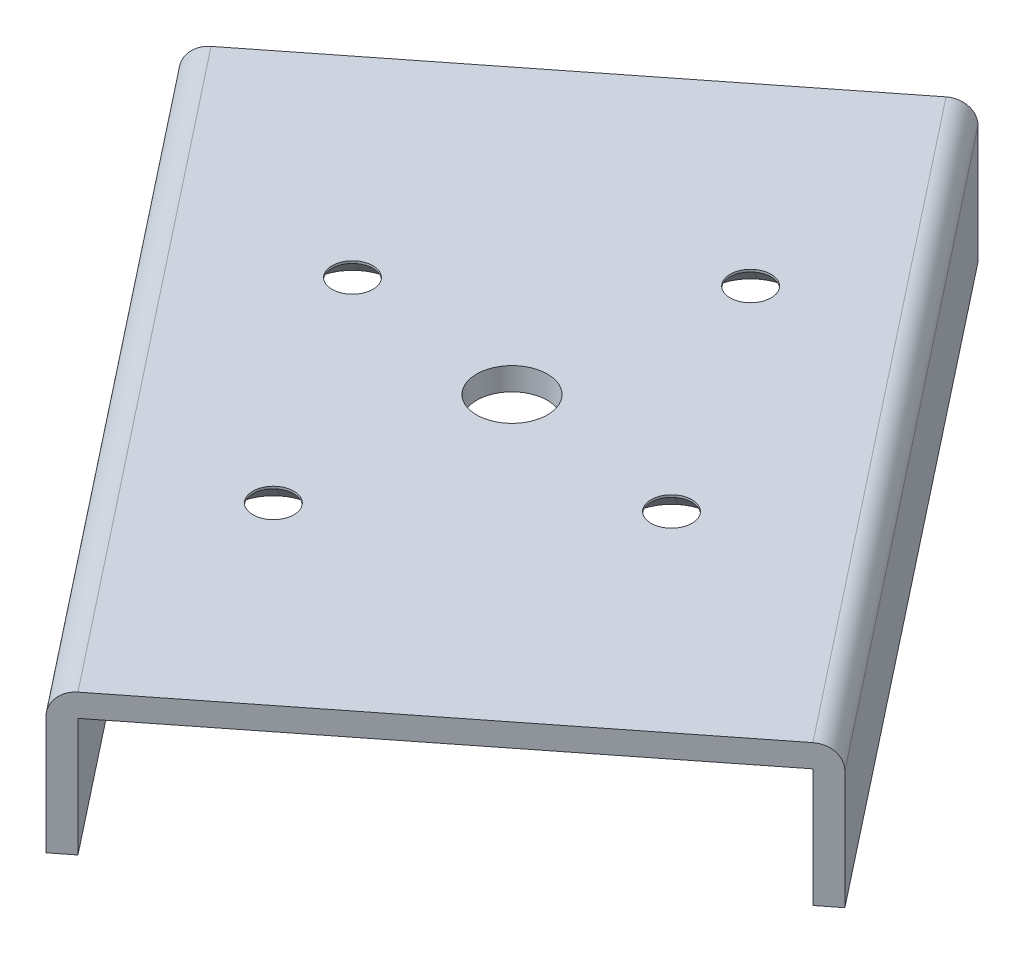
ISO-10303-21;
HEADER;
FILE_DESCRIPTION(('STEP AP214'),'2;1');
FILE_NAME('part.step','',(''),(''),'','','');
FILE_SCHEMA(('AUTOMOTIVE_DESIGN { 1 0 10303 214 1 1 1 1 }'));
ENDSEC;
DATA;
#1=APPLICATION_CONTEXT('core data for automotive mechanical design processes');
#2=APPLICATION_PROTOCOL_DEFINITION('international standard','automotive_design',2000,#1);
#3=PRODUCT_CONTEXT('',#1,'mechanical');
#4=PRODUCT('Part','Part','',(#3));
#5=PRODUCT_RELATED_PRODUCT_CATEGORY('part','',(#4));
#6=PRODUCT_DEFINITION_FORMATION('','',#4);
#7=PRODUCT_DEFINITION_CONTEXT('part definition',#1,'design');
#8=PRODUCT_DEFINITION('design','',#6,#7);
#9=PRODUCT_DEFINITION_SHAPE('','',#8);
#10=(LENGTH_UNIT() NAMED_UNIT(*) SI_UNIT(.MILLI.,.METRE.));
#11=(NAMED_UNIT(*) PLANE_ANGLE_UNIT() SI_UNIT($,.RADIAN.));
#12=(NAMED_UNIT(*) SI_UNIT($,.STERADIAN.) SOLID_ANGLE_UNIT());
#13=UNCERTAINTY_MEASURE_WITH_UNIT(LENGTH_MEASURE(1.E-05),#10,'distance_accuracy_value','');
#14=(GEOMETRIC_REPRESENTATION_CONTEXT(3) GLOBAL_UNCERTAINTY_ASSIGNED_CONTEXT((#13)) GLOBAL_UNIT_ASSIGNED_CONTEXT((#10,
#11,#12)) REPRESENTATION_CONTEXT('',''));
#15=CARTESIAN_POINT('',(0.,0.,0.));
#16=DIRECTION('',(0.,0.,1.));
#17=DIRECTION('',(1.,0.,0.));
#18=AXIS2_PLACEMENT_3D('',#15,#16,#17);
#19=CARTESIAN_POINT('',(156.638062088409,19.0000000000001,265.59404758917));
#20=DIRECTION('',(0.,-1.,0.));
#21=DIRECTION('',(0.618589574131745,0.,0.785714285714283));
#22=AXIS2_PLACEMENT_3D('',#19,#20,#21);
#23=CONICAL_SURFACE('',#22,1.8,0.785398163397449);
#24=DIRECTION('',(-0.437408882639855,-0.707106781186549,-0.555583899503713));
#25=VECTOR('',#24,1.);
#26=CARTESIAN_POINT('',(155.524600854972,19.,264.179761874884));
#27=LINE('',#26,#25);
#28=CARTESIAN_POINT('',(156.081331471691,19.9000000000001,264.886904732027));
#29=VERTEX_POINT('',#28);
#30=CARTESIAN_POINT('',(155.524600854972,19.,264.179761874884));
#31=VERTEX_POINT('',#30);
#32=EDGE_CURVE('E342',#29,#31,#27,.T.);
#33=ORIENTED_EDGE('',*,*,#32,.F.);
#34=CARTESIAN_POINT('',(156.638062088409,19.9000000000001,265.59404758917));
#35=DIRECTION('',(0.,-1.,0.));
#36=DIRECTION('',(0.618589574131745,0.,0.785714285714283));
#37=AXIS2_PLACEMENT_3D('',#34,#35,#36);
#38=CIRCLE('',#37,0.899999999999984);
#39=CARTESIAN_POINT('',(157.194792705128,19.9000000000001,266.301190446313));
#40=VERTEX_POINT('',#39);
#41=EDGE_CURVE('E11',#40,#29,#38,.T.);
#42=ORIENTED_EDGE('',*,*,#41,.F.);
#43=DIRECTION('',(0.437408882639856,-0.707106781186545,0.555583899503716));
#44=VECTOR('',#43,1.);
#45=CARTESIAN_POINT('',(157.751523321847,19.0000000000001,267.008333303456));
#46=LINE('',#45,#44);
#47=CARTESIAN_POINT('',(157.751523321847,19.0000000000001,267.008333303456));
#48=VERTEX_POINT('',#47);
#49=EDGE_CURVE('E341',#40,#48,#46,.T.);
#50=ORIENTED_EDGE('',*,*,#49,.T.);
#51=CARTESIAN_POINT('',(156.638062088409,19.0000000000001,265.59404758917));
#52=DIRECTION('',(0.,-1.,0.));
#53=DIRECTION('',(0.618589574131745,0.,0.785714285714283));
#54=AXIS2_PLACEMENT_3D('',#51,#52,#53);
#55=CIRCLE('',#54,1.8);
#56=EDGE_CURVE('E400',#48,#31,#55,.T.);
#57=ORIENTED_EDGE('',*,*,#56,.T.);
#58=EDGE_LOOP('',(#33,#42,#50,#57));
#59=FACE_BOUND('',#58,.T.);
#60=ADVANCED_FACE('F42',(#59),#23,.F.);
#61=CARTESIAN_POINT('',(156.638062088409,19.0000000000001,265.59404758917));
#62=DIRECTION('',(0.,-1.,0.));
#63=DIRECTION('',(0.618589574131745,0.,0.785714285714283));
#64=AXIS2_PLACEMENT_3D('',#61,#62,#63);
#65=CYLINDRICAL_SURFACE('',#64,0.899999999999981);
#66=DIRECTION('',(0.,-1.,0.));
#67=VECTOR('',#66,1.);
#68=CARTESIAN_POINT('',(156.081331471691,19.,264.886904732027));
#69=LINE('',#68,#67);
#70=CARTESIAN_POINT('',(156.081331471691,20.,264.886904732027));
#71=VERTEX_POINT('',#70);
#72=EDGE_CURVE('E380',#71,#29,#69,.T.);
#73=ORIENTED_EDGE('',*,*,#72,.F.);
#74=CARTESIAN_POINT('',(156.638062088409,20.,265.59404758917));
#75=DIRECTION('',(0.,-1.,0.));
#76=DIRECTION('',(0.785714285714283,0.,-0.618589574131745));
#77=AXIS2_PLACEMENT_3D('',#74,#75,#76);
#78=CIRCLE('',#77,0.89999999999998);
#79=CARTESIAN_POINT('',(157.194792705128,20.0000000000001,266.301190446313));
#80=VERTEX_POINT('',#79);
#81=EDGE_CURVE('E328',#80,#71,#78,.T.);
#82=ORIENTED_EDGE('',*,*,#81,.F.);
#83=DIRECTION('',(0.,-1.,0.));
#84=VECTOR('',#83,1.);
#85=CARTESIAN_POINT('',(157.194792705128,19.0000000000001,266.301190446313));
#86=LINE('',#85,#84);
#87=EDGE_CURVE('E389',#80,#40,#86,.T.);
#88=ORIENTED_EDGE('',*,*,#87,.T.);
#89=ORIENTED_EDGE('',*,*,#41,.T.);
#90=EDGE_LOOP('',(#73,#82,#88,#89));
#91=FACE_BOUND('',#90,.T.);
#92=ADVANCED_FACE('F615',(#91),#65,.F.);
#93=CARTESIAN_POINT('',(149.795627106775,19.,255.277049264943));
#94=DIRECTION('',(0.,-1.,0.));
#95=DIRECTION('',(0.618589574131745,0.,0.785714285714283));
#96=AXIS2_PLACEMENT_3D('',#93,#94,#95);
#97=CONICAL_SURFACE('',#96,1.8,0.785398163397449);
#98=DIRECTION('',(-0.437408882639855,-0.707106781186549,-0.555583899503713));
#99=VECTOR('',#98,1.);
#100=CARTESIAN_POINT('',(148.682165873337,19.,253.862763550657));
#101=LINE('',#100,#99);
#102=CARTESIAN_POINT('',(149.238896490056,19.9,254.5699064078));
#103=VERTEX_POINT('',#102);
#104=CARTESIAN_POINT('',(148.682165873337,19.,253.862763550657));
#105=VERTEX_POINT('',#104);
#106=EDGE_CURVE('E336',#103,#105,#101,.T.);
#107=ORIENTED_EDGE('',*,*,#106,.F.);
#108=CARTESIAN_POINT('',(149.795627106775,19.9,255.277049264943));
#109=DIRECTION('',(0.,-1.,0.));
#110=DIRECTION('',(0.618589574131745,0.,0.785714285714283));
#111=AXIS2_PLACEMENT_3D('',#108,#109,#110);
#112=CIRCLE('',#111,0.899999999999984);
#113=CARTESIAN_POINT('',(150.352357723493,19.9,255.984192122086));
#114=VERTEX_POINT('',#113);
#115=EDGE_CURVE('E53',#114,#103,#112,.T.);
#116=ORIENTED_EDGE('',*,*,#115,.F.);
#117=DIRECTION('',(0.437408882639856,-0.707106781186545,0.555583899503716));
#118=VECTOR('',#117,1.);
#119=CARTESIAN_POINT('',(150.909088340212,19.,256.691334979229));
#120=LINE('',#119,#118);
#121=CARTESIAN_POINT('',(150.909088340212,19.,256.691334979229));
#122=VERTEX_POINT('',#121);
#123=EDGE_CURVE('E335',#114,#122,#120,.T.);
#124=ORIENTED_EDGE('',*,*,#123,.T.);
#125=CARTESIAN_POINT('',(149.795627106775,19.,255.277049264943));
#126=DIRECTION('',(0.,-1.,0.));
#127=DIRECTION('',(0.618589574131745,0.,0.785714285714283));
#128=AXIS2_PLACEMENT_3D('',#125,#126,#127);
#129=CIRCLE('',#128,1.8);
#130=EDGE_CURVE('E346',#122,#105,#129,.T.);
#131=ORIENTED_EDGE('',*,*,#130,.T.);
#132=EDGE_LOOP('',(#107,#116,#124,#131));
#133=FACE_BOUND('',#132,.T.);
#134=ADVANCED_FACE('F620',(#133),#97,.F.);
#135=CARTESIAN_POINT('',(149.795627106775,19.,255.277049264943));
#136=DIRECTION('',(0.,-1.,0.));
#137=DIRECTION('',(0.618589574131745,0.,0.785714285714283));
#138=AXIS2_PLACEMENT_3D('',#135,#136,#137);
#139=CYLINDRICAL_SURFACE('',#138,0.899999999999979);
#140=DIRECTION('',(0.,-1.,0.));
#141=VECTOR('',#140,1.);
#142=CARTESIAN_POINT('',(149.238896490056,19.,254.5699064078));
#143=LINE('',#142,#141);
#144=CARTESIAN_POINT('',(149.238896490056,20.,254.5699064078));
#145=VERTEX_POINT('',#144);
#146=EDGE_CURVE('E465',#145,#103,#143,.T.);
#147=ORIENTED_EDGE('',*,*,#146,.F.);
#148=CARTESIAN_POINT('',(149.795627106775,20.,255.277049264943));
#149=DIRECTION('',(0.,-1.,0.));
#150=DIRECTION('',(0.785714285714283,0.,-0.618589574131745));
#151=AXIS2_PLACEMENT_3D('',#148,#149,#150);
#152=CIRCLE('',#151,0.899999999999979);
#153=CARTESIAN_POINT('',(150.352357723493,20.,255.984192122086));
#154=VERTEX_POINT('',#153);
#155=EDGE_CURVE('E325',#154,#145,#152,.T.);
#156=ORIENTED_EDGE('',*,*,#155,.F.);
#157=DIRECTION('',(0.,-1.,0.));
#158=VECTOR('',#157,1.);
#159=CARTESIAN_POINT('',(150.352357723493,19.,255.984192122086));
#160=LINE('',#159,#158);
#161=EDGE_CURVE('E528',#154,#114,#160,.T.);
#162=ORIENTED_EDGE('',*,*,#161,.T.);
#163=ORIENTED_EDGE('',*,*,#115,.T.);
#164=EDGE_LOOP('',(#147,#156,#162,#163));
#165=FACE_BOUND('',#164,.T.);
#166=ADVANCED_FACE('F564',(#165),#139,.F.);
#167=CARTESIAN_POINT('',(140.722969571882,19.,263.700009323886));
#168=DIRECTION('',(0.,-1.,0.));
#169=DIRECTION('',(0.618589574131745,0.,0.785714285714283));
#170=AXIS2_PLACEMENT_3D('',#167,#168,#169);
#171=CONICAL_SURFACE('',#170,1.8,0.785398163397449);
#172=DIRECTION('',(-0.437408882639855,-0.707106781186549,-0.555583899503713));
#173=VECTOR('',#172,1.);
#174=CARTESIAN_POINT('',(139.609508338445,19.,262.2857236096));
#175=LINE('',#174,#173);
#176=CARTESIAN_POINT('',(140.166238955163,19.9,262.992866466743));
#177=VERTEX_POINT('',#176);
#178=CARTESIAN_POINT('',(139.609508338445,19.,262.2857236096));
#179=VERTEX_POINT('',#178);
#180=EDGE_CURVE('E452',#177,#179,#175,.T.);
#181=ORIENTED_EDGE('',*,*,#180,.F.);
#182=CARTESIAN_POINT('',(140.722969571882,19.9,263.700009323886));
#183=DIRECTION('',(0.,-1.,0.));
#184=DIRECTION('',(0.618589574131745,0.,0.785714285714283));
#185=AXIS2_PLACEMENT_3D('',#182,#183,#184);
#186=CIRCLE('',#185,0.899999999999984);
#187=CARTESIAN_POINT('',(141.2797001886,19.9,264.407152181029));
#188=VERTEX_POINT('',#187);
#189=EDGE_CURVE('E287',#188,#177,#186,.T.);
#190=ORIENTED_EDGE('',*,*,#189,.F.);
#191=DIRECTION('',(0.437408882639856,-0.707106781186545,0.555583899503716));
#192=VECTOR('',#191,1.);
#193=CARTESIAN_POINT('',(141.836430805319,19.,265.114295038172));
#194=LINE('',#193,#192);
#195=CARTESIAN_POINT('',(141.836430805319,19.,265.114295038172));
#196=VERTEX_POINT('',#195);
#197=EDGE_CURVE('E360',#188,#196,#194,.T.);
#198=ORIENTED_EDGE('',*,*,#197,.T.);
#199=CARTESIAN_POINT('',(140.722969571882,19.,263.700009323886));
#200=DIRECTION('',(0.,-1.,0.));
#201=DIRECTION('',(0.618589574131745,0.,0.785714285714283));
#202=AXIS2_PLACEMENT_3D('',#199,#200,#201);
#203=CIRCLE('',#202,1.8);
#204=EDGE_CURVE('E343',#196,#179,#203,.T.);
#205=ORIENTED_EDGE('',*,*,#204,.T.);
#206=EDGE_LOOP('',(#181,#190,#198,#205));
#207=FACE_BOUND('',#206,.T.);
#208=ADVANCED_FACE('F666',(#207),#171,.F.);
#209=CARTESIAN_POINT('',(140.722969571882,19.,263.700009323886));
#210=DIRECTION('',(0.,-1.,0.));
#211=DIRECTION('',(0.618589574131745,0.,0.785714285714283));
#212=AXIS2_PLACEMENT_3D('',#209,#210,#211);
#213=CYLINDRICAL_SURFACE('',#212,0.899999999999979);
#214=DIRECTION('',(0.,-1.,0.));
#215=VECTOR('',#214,1.);
#216=CARTESIAN_POINT('',(140.166238955163,19.,262.992866466743));
#217=LINE('',#216,#215);
#218=CARTESIAN_POINT('',(140.166238955163,20.,262.992866466743));
#219=VERTEX_POINT('',#218);
#220=EDGE_CURVE('E317',#219,#177,#217,.T.);
#221=ORIENTED_EDGE('',*,*,#220,.F.);
#222=CARTESIAN_POINT('',(140.722969571882,20.,263.700009323886));
#223=DIRECTION('',(0.,-1.,0.));
#224=DIRECTION('',(0.785714285714283,0.,-0.618589574131745));
#225=AXIS2_PLACEMENT_3D('',#222,#223,#224);
#226=CIRCLE('',#225,0.899999999999979);
#227=CARTESIAN_POINT('',(141.2797001886,20.,264.407152181029));
#228=VERTEX_POINT('',#227);
#229=EDGE_CURVE('E266',#228,#219,#226,.T.);
#230=ORIENTED_EDGE('',*,*,#229,.F.);
#231=DIRECTION('',(0.,-1.,0.));
#232=VECTOR('',#231,1.);
#233=CARTESIAN_POINT('',(141.2797001886,19.,264.407152181029));
#234=LINE('',#233,#232);
#235=EDGE_CURVE('E311',#228,#188,#234,.T.);
#236=ORIENTED_EDGE('',*,*,#235,.T.);
#237=ORIENTED_EDGE('',*,*,#189,.T.);
#238=EDGE_LOOP('',(#221,#230,#236,#237));
#239=FACE_BOUND('',#238,.T.);
#240=ADVANCED_FACE('F628',(#239),#213,.F.);
#241=CARTESIAN_POINT('',(147.565404553517,19.0000000000001,274.017007648113));
#242=DIRECTION('',(0.,-1.,0.));
#243=DIRECTION('',(0.618589574131745,0.,0.785714285714283));
#244=AXIS2_PLACEMENT_3D('',#241,#242,#243);
#245=CONICAL_SURFACE('',#244,1.8,0.785398163397449);
#246=DIRECTION('',(-0.437408882639855,-0.707106781186549,-0.555583899503713));
#247=VECTOR('',#246,1.);
#248=CARTESIAN_POINT('',(146.451943320079,19.,272.602721933827));
#249=LINE('',#248,#247);
#250=CARTESIAN_POINT('',(147.008673936798,19.9000000000001,273.30986479097));
#251=VERTEX_POINT('',#250);
#252=CARTESIAN_POINT('',(146.451943320079,19.,272.602721933827));
#253=VERTEX_POINT('',#252);
#254=EDGE_CURVE('E299',#251,#253,#249,.T.);
#255=ORIENTED_EDGE('',*,*,#254,.F.);
#256=CARTESIAN_POINT('',(147.565404553517,19.9000000000001,274.017007648113));
#257=DIRECTION('',(0.,-1.,0.));
#258=DIRECTION('',(0.618589574131745,0.,0.785714285714283));
#259=AXIS2_PLACEMENT_3D('',#256,#257,#258);
#260=CIRCLE('',#259,0.899999999999984);
#261=CARTESIAN_POINT('',(148.122135170235,19.9000000000001,274.724150505256));
#262=VERTEX_POINT('',#261);
#263=EDGE_CURVE('E275',#262,#251,#260,.T.);
#264=ORIENTED_EDGE('',*,*,#263,.F.);
#265=DIRECTION('',(0.437408882639856,-0.707106781186545,0.555583899503716));
#266=VECTOR('',#265,1.);
#267=CARTESIAN_POINT('',(148.678865786954,19.0000000000001,275.431293362399));
#268=LINE('',#267,#266);
#269=CARTESIAN_POINT('',(148.678865786954,19.0000000000001,275.431293362399));
#270=VERTEX_POINT('',#269);
#271=EDGE_CURVE('E309',#262,#270,#268,.T.);
#272=ORIENTED_EDGE('',*,*,#271,.T.);
#273=CARTESIAN_POINT('',(147.565404553517,19.0000000000001,274.017007648113));
#274=DIRECTION('',(0.,-1.,0.));
#275=DIRECTION('',(0.618589574131745,0.,0.785714285714283));
#276=AXIS2_PLACEMENT_3D('',#273,#274,#275);
#277=CIRCLE('',#276,1.8);
#278=EDGE_CURVE('E301',#270,#253,#277,.T.);
#279=ORIENTED_EDGE('',*,*,#278,.T.);
#280=EDGE_LOOP('',(#255,#264,#272,#279));
#281=FACE_BOUND('',#280,.T.);
#282=ADVANCED_FACE('F300',(#281),#245,.F.);
#283=CARTESIAN_POINT('',(147.565404553517,19.0000000000001,274.017007648113));
#284=DIRECTION('',(0.,-1.,0.));
#285=DIRECTION('',(0.618589574131745,0.,0.785714285714283));
#286=AXIS2_PLACEMENT_3D('',#283,#284,#285);
#287=CYLINDRICAL_SURFACE('',#286,0.899999999999981);
#288=DIRECTION('',(0.,-1.,0.));
#289=VECTOR('',#288,1.);
#290=CARTESIAN_POINT('',(147.008673936798,19.0000000000001,273.30986479097));
#291=LINE('',#290,#289);
#292=CARTESIAN_POINT('',(147.008673936798,20.,273.30986479097));
#293=VERTEX_POINT('',#292);
#294=EDGE_CURVE('E278',#293,#251,#291,.T.);
#295=ORIENTED_EDGE('',*,*,#294,.F.);
#296=CARTESIAN_POINT('',(147.565404553517,20.,274.017007648113));
#297=DIRECTION('',(0.,-1.,0.));
#298=DIRECTION('',(0.785714285714283,0.,-0.618589574131745));
#299=AXIS2_PLACEMENT_3D('',#296,#297,#298);
#300=CIRCLE('',#299,0.89999999999998);
#301=CARTESIAN_POINT('',(148.122135170235,20.0000000000001,274.724150505256));
#302=VERTEX_POINT('',#301);
#303=EDGE_CURVE('E324',#302,#293,#300,.T.);
#304=ORIENTED_EDGE('',*,*,#303,.F.);
#305=DIRECTION('',(0.,-1.,0.));
#306=VECTOR('',#305,1.);
#307=CARTESIAN_POINT('',(148.122135170235,19.0000000000001,274.724150505256));
#308=LINE('',#307,#306);
#309=EDGE_CURVE('E281',#302,#262,#308,.T.);
#310=ORIENTED_EDGE('',*,*,#309,.T.);
#311=ORIENTED_EDGE('',*,*,#263,.T.);
#312=EDGE_LOOP('',(#295,#304,#310,#311));
#313=FACE_BOUND('',#312,.T.);
#314=ADVANCED_FACE('F277',(#313),#287,.F.);
#315=CARTESIAN_POINT('',(148.680515830145,25.8735254993235,264.647028456528));
#316=DIRECTION('',(0.,-1.,0.));
#317=DIRECTION('',(0.785714285714283,0.,-0.618589574131745));
#318=AXIS2_PLACEMENT_3D('',#315,#316,#317);
#319=CYLINDRICAL_SURFACE('',#318,1.55575);
#320=DIRECTION('',(0.,-1.,0.));
#321=VECTOR('',#320,1.);
#322=CARTESIAN_POINT('',(147.458140830145,25.8735254993235,265.609399186483));
#323=LINE('',#322,#321);
#324=CARTESIAN_POINT('',(147.458140830146,20.,265.609399186483));
#325=VERTEX_POINT('',#324);
#326=CARTESIAN_POINT('',(147.458140830146,19.,265.609399186483));
#327=VERTEX_POINT('',#326);
#328=EDGE_CURVE('E489',#325,#327,#323,.T.);
#329=ORIENTED_EDGE('',*,*,#328,.F.);
#330=CARTESIAN_POINT('',(148.680515830146,20.,264.647028456528));
#331=DIRECTION('',(0.,-1.,0.));
#332=DIRECTION('',(0.785714285714283,0.,-0.618589574131745));
#333=AXIS2_PLACEMENT_3D('',#330,#331,#332);
#334=CIRCLE('',#333,1.55575);
#335=CARTESIAN_POINT('',(149.902890830146,20.,263.684657726573));
#336=VERTEX_POINT('',#335);
#337=EDGE_CURVE('E431',#336,#325,#334,.T.);
#338=ORIENTED_EDGE('',*,*,#337,.F.);
#339=DIRECTION('',(0.,-1.,0.));
#340=VECTOR('',#339,1.);
#341=CARTESIAN_POINT('',(149.902890830146,25.8735254993235,263.684657726573));
#342=LINE('',#341,#340);
#343=CARTESIAN_POINT('',(149.902890830146,19.,263.684657726573));
#344=VERTEX_POINT('',#343);
#345=EDGE_CURVE('E421',#336,#344,#342,.T.);
#346=ORIENTED_EDGE('',*,*,#345,.T.);
#347=CARTESIAN_POINT('',(148.680515830146,19.,264.647028456528));
#348=DIRECTION('',(0.,-1.,0.));
#349=DIRECTION('',(0.785714285714283,0.,-0.618589574131745));
#350=AXIS2_PLACEMENT_3D('',#347,#348,#349);
#351=CIRCLE('',#350,1.55575);
#352=EDGE_CURVE('E211',#344,#327,#351,.T.);
#353=ORIENTED_EDGE('',*,*,#352,.T.);
#354=EDGE_LOOP('',(#329,#338,#346,#353));
#355=FACE_BOUND('',#354,.T.);
#356=ADVANCED_FACE('F641',(#355),#319,.F.);
#357=CARTESIAN_POINT('',(146.890912568554,19.,243.783248354013));
#358=DIRECTION('',(0.618589574131745,0.,0.785714285714283));
#359=DIRECTION('',(-0.785714285714283,0.,0.618589574131745));
#360=AXIS2_PLACEMENT_3D('',#357,#358,#359);
#361=PLANE('',#360);
#362=DIRECTION('',(0.,-1.,0.));
#363=VECTOR('',#362,1.);
#364=CARTESIAN_POINT('',(128.033769711411,19.,258.629398133175));
#365=LINE('',#364,#363);
#366=CARTESIAN_POINT('',(128.033769711411,19.,258.629398133175));
#367=VERTEX_POINT('',#366);
#368=CARTESIAN_POINT('',(128.033769711411,13.8,258.629398133175));
#369=VERTEX_POINT('',#368);
#370=EDGE_CURVE('E423',#367,#369,#365,.T.);
#371=ORIENTED_EDGE('',*,*,#370,.F.);
#372=CARTESIAN_POINT('',(128.819483997126,19.,258.010808559043));
#373=DIRECTION('',(0.618589574131745,0.,0.785714285714283));
#374=DIRECTION('',(-0.785714285714283,0.,0.618589574131745));
#375=AXIS2_PLACEMENT_3D('',#372,#373,#374);
#376=CIRCLE('',#375,1.);
#377=CARTESIAN_POINT('',(128.819483997126,20.,258.010808559043));
#378=VERTEX_POINT('',#377);
#379=EDGE_CURVE('E219',#378,#367,#376,.T.);
#380=ORIENTED_EDGE('',*,*,#379,.F.);
#381=DIRECTION('',(-0.785714285714283,0.,0.618589574131745));
#382=VECTOR('',#381,1.);
#383=CARTESIAN_POINT('',(146.890912568554,20.,243.783248354013));
#384=LINE('',#383,#382);
#385=CARTESIAN_POINT('',(146.890912568554,20.,243.783248354013));
#386=VERTEX_POINT('',#385);
#387=EDGE_CURVE('E240',#386,#378,#384,.T.);
#388=ORIENTED_EDGE('',*,*,#387,.F.);
#389=CARTESIAN_POINT('',(146.890912568554,19.,243.783248354013));
#390=DIRECTION('',(0.618589574131745,0.,0.785714285714283));
#391=DIRECTION('',(-0.785714285714283,0.,0.618589574131745));
#392=AXIS2_PLACEMENT_3D('',#389,#390,#391);
#393=CIRCLE('',#392,1.);
#394=CARTESIAN_POINT('',(147.676626854269,19.,243.164658779881));
#395=VERTEX_POINT('',#394);
#396=EDGE_CURVE('E456',#395,#386,#393,.T.);
#397=ORIENTED_EDGE('',*,*,#396,.F.);
#398=DIRECTION('',(0.,1.,0.));
#399=VECTOR('',#398,1.);
#400=CARTESIAN_POINT('',(147.676626854269,13.8,243.164658779881));
#401=LINE('',#400,#399);
#402=CARTESIAN_POINT('',(147.676626854269,13.8,243.164658779881));
#403=VERTEX_POINT('',#402);
#404=EDGE_CURVE('E469',#403,#395,#401,.T.);
#405=ORIENTED_EDGE('',*,*,#404,.F.);
#406=DIRECTION('',(-0.785714285714283,0.,0.618589574131745));
#407=VECTOR('',#406,1.);
#408=CARTESIAN_POINT('',(147.676626854269,13.8,243.164658779881));
#409=LINE('',#408,#407);
#410=CARTESIAN_POINT('',(146.890912568554,13.8,243.783248354013));
#411=VERTEX_POINT('',#410);
#412=EDGE_CURVE('E483',#403,#411,#409,.T.);
#413=ORIENTED_EDGE('',*,*,#412,.T.);
#414=DIRECTION('',(0.,1.,0.));
#415=VECTOR('',#414,1.);
#416=CARTESIAN_POINT('',(146.890912568554,13.8,243.783248354013));
#417=LINE('',#416,#415);
#418=CARTESIAN_POINT('',(146.890912568554,19.,243.783248354013));
#419=VERTEX_POINT('',#418);
#420=EDGE_CURVE('E356',#411,#419,#417,.T.);
#421=ORIENTED_EDGE('',*,*,#420,.T.);
#422=DIRECTION('',(-0.785714285714283,0.,0.618589574131745));
#423=VECTOR('',#422,1.);
#424=CARTESIAN_POINT('',(146.890912568554,19.,243.783248354013));
#425=LINE('',#424,#423);
#426=CARTESIAN_POINT('',(128.819483997126,19.,258.010808559043));
#427=VERTEX_POINT('',#426);
#428=EDGE_CURVE('E374',#419,#427,#425,.T.);
#429=ORIENTED_EDGE('',*,*,#428,.T.);
#430=DIRECTION('',(0.,-1.,0.));
#431=VECTOR('',#430,1.);
#432=CARTESIAN_POINT('',(128.819483997126,19.,258.010808559043));
#433=LINE('',#432,#431);
#434=CARTESIAN_POINT('',(128.819483997126,13.8,258.010808559043));
#435=VERTEX_POINT('',#434);
#436=EDGE_CURVE('E479',#427,#435,#433,.T.);
#437=ORIENTED_EDGE('',*,*,#436,.T.);
#438=DIRECTION('',(-0.785714285714283,0.,0.618589574131745));
#439=VECTOR('',#438,1.);
#440=CARTESIAN_POINT('',(128.819483997126,13.8,258.010808559043));
#441=LINE('',#440,#439);
#442=EDGE_CURVE('E370',#435,#369,#441,.T.);
#443=ORIENTED_EDGE('',*,*,#442,.T.);
#444=EDGE_LOOP('',(#371,#380,#388,#397,#405,#413,#421,#429,#437,#443));
#445=FACE_BOUND('',#444,.T.);
#446=ADVANCED_FACE('F590',(#445),#361,.F.);
#447=CARTESIAN_POINT('',(168.541547663165,19.0000000000001,271.283248354013));
#448=DIRECTION('',(0.618589574131745,0.,0.785714285714283));
#449=DIRECTION('',(-0.785714285714283,0.,0.618589574131745));
#450=AXIS2_PLACEMENT_3D('',#447,#448,#449);
#451=PLANE('',#450);
#452=DIRECTION('',(0.,-1.,0.));
#453=VECTOR('',#452,1.);
#454=CARTESIAN_POINT('',(149.684404806023,19.0000000000001,286.129398133175));
#455=LINE('',#454,#453);
#456=CARTESIAN_POINT('',(149.684404806023,19.0000000000001,286.129398133175));
#457=VERTEX_POINT('',#456);
#458=CARTESIAN_POINT('',(149.684404806023,13.8000000000001,286.129398133175));
#459=VERTEX_POINT('',#458);
#460=EDGE_CURVE('E428',#457,#459,#455,.T.);
#461=ORIENTED_EDGE('',*,*,#460,.T.);
#462=DIRECTION('',(-0.785714285714283,0.,0.618589574131745));
#463=VECTOR('',#462,1.);
#464=CARTESIAN_POINT('',(150.470119091737,13.8000000000001,285.510808559043));
#465=LINE('',#464,#463);
#466=CARTESIAN_POINT('',(150.470119091737,13.8000000000001,285.510808559043));
#467=VERTEX_POINT('',#466);
#468=EDGE_CURVE('E369',#467,#459,#465,.T.);
#469=ORIENTED_EDGE('',*,*,#468,.F.);
#470=DIRECTION('',(0.,-1.,0.));
#471=VECTOR('',#470,1.);
#472=CARTESIAN_POINT('',(150.470119091737,19.0000000000001,285.510808559043));
#473=LINE('',#472,#471);
#474=CARTESIAN_POINT('',(150.470119091737,19.0000000000001,285.510808559043));
#475=VERTEX_POINT('',#474);
#476=EDGE_CURVE('E371',#475,#467,#473,.T.);
#477=ORIENTED_EDGE('',*,*,#476,.F.);
#478=DIRECTION('',(-0.785714285714283,0.,0.618589574131745));
#479=VECTOR('',#478,1.);
#480=CARTESIAN_POINT('',(168.541547663165,19.0000000000001,271.283248354013));
#481=LINE('',#480,#479);
#482=CARTESIAN_POINT('',(168.541547663165,19.0000000000001,271.283248354013));
#483=VERTEX_POINT('',#482);
#484=EDGE_CURVE('E385',#483,#475,#481,.T.);
#485=ORIENTED_EDGE('',*,*,#484,.F.);
#486=DIRECTION('',(0.,1.,0.));
#487=VECTOR('',#486,1.);
#488=CARTESIAN_POINT('',(168.541547663165,13.8000000000001,271.283248354013));
#489=LINE('',#488,#487);
#490=CARTESIAN_POINT('',(168.541547663165,13.8000000000001,271.283248354013));
#491=VERTEX_POINT('',#490);
#492=EDGE_CURVE('E355',#491,#483,#489,.T.);
#493=ORIENTED_EDGE('',*,*,#492,.F.);
#494=DIRECTION('',(-0.785714285714283,0.,0.618589574131745));
#495=VECTOR('',#494,1.);
#496=CARTESIAN_POINT('',(169.32726194888,13.8000000000001,270.664658779881));
#497=LINE('',#496,#495);
#498=CARTESIAN_POINT('',(169.32726194888,13.8000000000001,270.664658779881));
#499=VERTEX_POINT('',#498);
#500=EDGE_CURVE('E466',#499,#491,#497,.T.);
#501=ORIENTED_EDGE('',*,*,#500,.F.);
#502=DIRECTION('',(0.,1.,0.));
#503=VECTOR('',#502,1.);
#504=CARTESIAN_POINT('',(169.32726194888,13.8000000000001,270.664658779881));
#505=LINE('',#504,#503);
#506=CARTESIAN_POINT('',(169.32726194888,19.0000000000001,270.664658779881));
#507=VERTEX_POINT('',#506);
#508=EDGE_CURVE('E460',#499,#507,#505,.T.);
#509=ORIENTED_EDGE('',*,*,#508,.T.);
#510=CARTESIAN_POINT('',(168.541547663165,19.0000000000001,271.283248354013));
#511=DIRECTION('',(0.618589574131745,0.,0.785714285714283));
#512=DIRECTION('',(-0.785714285714283,0.,0.618589574131745));
#513=AXIS2_PLACEMENT_3D('',#510,#511,#512);
#514=CIRCLE('',#513,1.);
#515=CARTESIAN_POINT('',(168.541547663165,20.0000000000001,271.283248354013));
#516=VERTEX_POINT('',#515);
#517=EDGE_CURVE('E397',#507,#516,#514,.T.);
#518=ORIENTED_EDGE('',*,*,#517,.T.);
#519=DIRECTION('',(-0.785714285714283,0.,0.618589574131745));
#520=VECTOR('',#519,1.);
#521=CARTESIAN_POINT('',(168.541547663165,20.0000000000001,271.283248354013));
#522=LINE('',#521,#520);
#523=CARTESIAN_POINT('',(150.470119091737,20.0000000000001,285.510808559043));
#524=VERTEX_POINT('',#523);
#525=EDGE_CURVE('E230',#516,#524,#522,.T.);
#526=ORIENTED_EDGE('',*,*,#525,.T.);
#527=CARTESIAN_POINT('',(150.470119091737,19.0000000000001,285.510808559043));
#528=DIRECTION('',(0.618589574131745,0.,0.785714285714283));
#529=DIRECTION('',(-0.785714285714283,0.,0.618589574131745));
#530=AXIS2_PLACEMENT_3D('',#527,#528,#529);
#531=CIRCLE('',#530,1.);
#532=EDGE_CURVE('E66',#524,#457,#531,.T.);
#533=ORIENTED_EDGE('',*,*,#532,.T.);
#534=EDGE_LOOP('',(#461,#469,#477,#485,#493,#501,#509,#518,#526,#533));
#535=FACE_BOUND('',#534,.T.);
#536=ADVANCED_FACE('F583',(#535),#451,.T.);
#537=CARTESIAN_POINT('',(150.470119091737,19.0000000000001,285.510808559043));
#538=DIRECTION('',(-0.618589574131745,0.,-0.785714285714283));
#539=DIRECTION('',(0.785714285714283,0.,-0.618589574131745));
#540=AXIS2_PLACEMENT_3D('',#537,#538,#539);
#541=CYLINDRICAL_SURFACE('',#540,1.);
#542=ORIENTED_EDGE('',*,*,#379,.T.);
#543=DIRECTION('',(-0.618589574131745,0.,-0.785714285714283));
#544=VECTOR('',#543,1.);
#545=CARTESIAN_POINT('',(149.684404806023,19.0000000000001,286.129398133175));
#546=LINE('',#545,#544);
#547=EDGE_CURVE('E425',#457,#367,#546,.T.);
#548=ORIENTED_EDGE('',*,*,#547,.F.);
#549=ORIENTED_EDGE('',*,*,#532,.F.);
#550=DIRECTION('',(-0.618589574131745,0.,-0.785714285714283));
#551=VECTOR('',#550,1.);
#552=CARTESIAN_POINT('',(150.470119091737,20.0000000000001,285.510808559043));
#553=LINE('',#552,#551);
#554=EDGE_CURVE('E396',#524,#378,#553,.T.);
#555=ORIENTED_EDGE('',*,*,#554,.T.);
#556=EDGE_LOOP('',(#542,#548,#549,#555));
#557=FACE_BOUND('',#556,.T.);
#558=ADVANCED_FACE('F602',(#557),#541,.T.);
#559=CARTESIAN_POINT('',(168.541547663165,20.0000000000001,271.283248354013));
#560=DIRECTION('',(0.,-1.,0.));
#561=DIRECTION('',(-0.785714285714283,0.,0.618589574131745));
#562=AXIS2_PLACEMENT_3D('',#559,#560,#561);
#563=PLANE('',#562);
#564=ORIENTED_EDGE('',*,*,#337,.T.);
#565=CARTESIAN_POINT('',(148.680515830146,20.,264.647028456528));
#566=DIRECTION('',(0.,-1.,0.));
#567=DIRECTION('',(0.785714285714283,0.,-0.618589574131745));
#568=AXIS2_PLACEMENT_3D('',#565,#566,#567);
#569=CIRCLE('',#568,1.55575);
#570=EDGE_CURVE('E388',#325,#336,#569,.T.);
#571=ORIENTED_EDGE('',*,*,#570,.T.);
#572=EDGE_LOOP('',(#564,#571));
#573=FACE_BOUND('',#572,.T.);
#574=ORIENTED_EDGE('',*,*,#303,.T.);
#575=CARTESIAN_POINT('',(147.565404553517,20.,274.017007648113));
#576=DIRECTION('',(0.,-1.,0.));
#577=DIRECTION('',(0.785714285714283,0.,-0.618589574131745));
#578=AXIS2_PLACEMENT_3D('',#575,#576,#577);
#579=CIRCLE('',#578,0.89999999999998);
#580=EDGE_CURVE('E295',#293,#302,#579,.T.);
#581=ORIENTED_EDGE('',*,*,#580,.T.);
#582=EDGE_LOOP('',(#574,#581));
#583=FACE_BOUND('',#582,.T.);
#584=ORIENTED_EDGE('',*,*,#229,.T.);
#585=CARTESIAN_POINT('',(140.722969571882,20.,263.700009323886));
#586=DIRECTION('',(0.,-1.,0.));
#587=DIRECTION('',(0.785714285714283,0.,-0.618589574131745));
#588=AXIS2_PLACEMENT_3D('',#585,#586,#587);
#589=CIRCLE('',#588,0.899999999999979);
#590=EDGE_CURVE('E363',#219,#228,#589,.T.);
#591=ORIENTED_EDGE('',*,*,#590,.T.);
#592=EDGE_LOOP('',(#584,#591));
#593=FACE_BOUND('',#592,.T.);
#594=ORIENTED_EDGE('',*,*,#155,.T.);
#595=CARTESIAN_POINT('',(149.795627106775,20.,255.277049264943));
#596=DIRECTION('',(0.,-1.,0.));
#597=DIRECTION('',(0.785714285714283,0.,-0.618589574131745));
#598=AXIS2_PLACEMENT_3D('',#595,#596,#597);
#599=CIRCLE('',#598,0.899999999999979);
#600=EDGE_CURVE('E461',#145,#154,#599,.T.);
#601=ORIENTED_EDGE('',*,*,#600,.T.);
#602=EDGE_LOOP('',(#594,#601));
#603=FACE_BOUND('',#602,.T.);
#604=ORIENTED_EDGE('',*,*,#81,.T.);
#605=CARTESIAN_POINT('',(156.638062088409,20.,265.59404758917));
#606=DIRECTION('',(0.,-1.,0.));
#607=DIRECTION('',(0.785714285714283,0.,-0.618589574131745));
#608=AXIS2_PLACEMENT_3D('',#605,#606,#607);
#609=CIRCLE('',#608,0.89999999999998);
#610=EDGE_CURVE('E376',#71,#80,#609,.T.);
#611=ORIENTED_EDGE('',*,*,#610,.T.);
#612=EDGE_LOOP('',(#604,#611));
#613=FACE_BOUND('',#612,.T.);
#614=ORIENTED_EDGE('',*,*,#387,.T.);
#615=ORIENTED_EDGE('',*,*,#554,.F.);
#616=ORIENTED_EDGE('',*,*,#525,.F.);
#617=DIRECTION('',(-0.618589574131745,0.,-0.785714285714283));
#618=VECTOR('',#617,1.);
#619=CARTESIAN_POINT('',(168.541547663165,20.0000000000001,271.283248354013));
#620=LINE('',#619,#618);
#621=EDGE_CURVE('E449',#516,#386,#620,.T.);
#622=ORIENTED_EDGE('',*,*,#621,.T.);
#623=EDGE_LOOP('',(#614,#615,#616,#622));
#624=FACE_BOUND('',#623,.T.);
#625=ADVANCED_FACE('F562',(#573,#583,#593,#603,#613,#624),#563,.F.);
#626=CARTESIAN_POINT('',(168.541547663165,19.0000000000001,271.283248354013));
#627=DIRECTION('',(-0.618589574131745,0.,-0.785714285714283));
#628=DIRECTION('',(0.785714285714283,0.,-0.618589574131745));
#629=AXIS2_PLACEMENT_3D('',#626,#627,#628);
#630=CYLINDRICAL_SURFACE('',#629,1.);
#631=ORIENTED_EDGE('',*,*,#396,.T.);
#632=ORIENTED_EDGE('',*,*,#621,.F.);
#633=ORIENTED_EDGE('',*,*,#517,.F.);
#634=DIRECTION('',(-0.618589574131745,0.,-0.785714285714283));
#635=VECTOR('',#634,1.);
#636=CARTESIAN_POINT('',(169.32726194888,19.0000000000001,270.664658779881));
#637=LINE('',#636,#635);
#638=EDGE_CURVE('E526',#507,#395,#637,.T.);
#639=ORIENTED_EDGE('',*,*,#638,.T.);
#640=EDGE_LOOP('',(#631,#632,#633,#639));
#641=FACE_BOUND('',#640,.T.);
#642=ADVANCED_FACE('F600',(#641),#630,.T.);
#643=CARTESIAN_POINT('',(169.32726194888,13.8000000000001,270.664658779881));
#644=DIRECTION('',(-0.785714285714283,0.,0.618589574131745));
#645=DIRECTION('',(0.,-1.,0.));
#646=AXIS2_PLACEMENT_3D('',#643,#644,#645);
#647=PLANE('',#646);
#648=ORIENTED_EDGE('',*,*,#404,.T.);
#649=ORIENTED_EDGE('',*,*,#638,.F.);
#650=ORIENTED_EDGE('',*,*,#508,.F.);
#651=DIRECTION('',(-0.618589574131745,0.,-0.785714285714283));
#652=VECTOR('',#651,1.);
#653=CARTESIAN_POINT('',(169.32726194888,13.8000000000001,270.664658779881));
#654=LINE('',#653,#652);
#655=EDGE_CURVE('E470',#499,#403,#654,.T.);
#656=ORIENTED_EDGE('',*,*,#655,.T.);
#657=EDGE_LOOP('',(#648,#649,#650,#656));
#658=FACE_BOUND('',#657,.T.);
#659=ADVANCED_FACE('F598',(#658),#647,.F.);
#660=CARTESIAN_POINT('',(169.32726194888,13.8000000000001,270.664658779881));
#661=DIRECTION('',(0.,-1.,0.));
#662=DIRECTION('',(-0.785714285714283,0.,0.618589574131745));
#663=AXIS2_PLACEMENT_3D('',#660,#661,#662);
#664=PLANE('',#663);
#665=ORIENTED_EDGE('',*,*,#412,.F.);
#666=ORIENTED_EDGE('',*,*,#655,.F.);
#667=ORIENTED_EDGE('',*,*,#500,.T.);
#668=DIRECTION('',(-0.618589574131745,0.,-0.785714285714283));
#669=VECTOR('',#668,1.);
#670=CARTESIAN_POINT('',(168.541547663165,13.8000000000001,271.283248354013));
#671=LINE('',#670,#669);
#672=EDGE_CURVE('E351',#491,#411,#671,.T.);
#673=ORIENTED_EDGE('',*,*,#672,.T.);
#674=EDGE_LOOP('',(#665,#666,#667,#673));
#675=FACE_BOUND('',#674,.T.);
#676=ADVANCED_FACE('F594',(#675),#664,.T.);
#677=CARTESIAN_POINT('',(168.541547663165,13.8000000000001,271.283248354013));
#678=DIRECTION('',(-0.785714285714283,0.,0.618589574131745));
#679=DIRECTION('',(0.,-1.,0.));
#680=AXIS2_PLACEMENT_3D('',#677,#678,#679);
#681=PLANE('',#680);
#682=ORIENTED_EDGE('',*,*,#420,.F.);
#683=ORIENTED_EDGE('',*,*,#672,.F.);
#684=ORIENTED_EDGE('',*,*,#492,.T.);
#685=DIRECTION('',(-0.618589574131745,0.,-0.785714285714283));
#686=VECTOR('',#685,1.);
#687=CARTESIAN_POINT('',(168.541547663165,19.0000000000001,271.283248354013));
#688=LINE('',#687,#686);
#689=EDGE_CURVE('E381',#483,#419,#688,.T.);
#690=ORIENTED_EDGE('',*,*,#689,.T.);
#691=EDGE_LOOP('',(#682,#683,#684,#690));
#692=FACE_BOUND('',#691,.T.);
#693=ADVANCED_FACE('F577',(#692),#681,.T.);
#694=CARTESIAN_POINT('',(168.541547663165,19.0000000000001,271.283248354013));
#695=DIRECTION('',(0.,-1.,0.));
#696=DIRECTION('',(-0.785714285714283,0.,0.618589574131745));
#697=AXIS2_PLACEMENT_3D('',#694,#695,#696);
#698=PLANE('',#697);
#699=ORIENTED_EDGE('',*,*,#352,.F.);
#700=CARTESIAN_POINT('',(148.680515830146,19.,264.647028456528));
#701=DIRECTION('',(0.,-1.,0.));
#702=DIRECTION('',(0.785714285714283,0.,-0.618589574131745));
#703=AXIS2_PLACEMENT_3D('',#700,#701,#702);
#704=CIRCLE('',#703,1.55575);
#705=EDGE_CURVE('E424',#327,#344,#704,.T.);
#706=ORIENTED_EDGE('',*,*,#705,.F.);
#707=EDGE_LOOP('',(#699,#706));
#708=FACE_BOUND('',#707,.T.);
#709=ORIENTED_EDGE('',*,*,#278,.F.);
#710=CARTESIAN_POINT('',(147.565404553517,19.0000000000001,274.017007648113));
#711=DIRECTION('',(0.,-1.,0.));
#712=DIRECTION('',(0.618589574131745,0.,0.785714285714283));
#713=AXIS2_PLACEMENT_3D('',#710,#711,#712);
#714=CIRCLE('',#713,1.8);
#715=EDGE_CURVE('E306',#253,#270,#714,.T.);
#716=ORIENTED_EDGE('',*,*,#715,.F.);
#717=EDGE_LOOP('',(#709,#716));
#718=FACE_BOUND('',#717,.T.);
#719=ORIENTED_EDGE('',*,*,#204,.F.);
#720=CARTESIAN_POINT('',(140.722969571882,19.,263.700009323886));
#721=DIRECTION('',(0.,-1.,0.));
#722=DIRECTION('',(0.618589574131745,0.,0.785714285714283));
#723=AXIS2_PLACEMENT_3D('',#720,#721,#722);
#724=CIRCLE('',#723,1.8);
#725=EDGE_CURVE('E321',#179,#196,#724,.T.);
#726=ORIENTED_EDGE('',*,*,#725,.F.);
#727=EDGE_LOOP('',(#719,#726));
#728=FACE_BOUND('',#727,.T.);
#729=ORIENTED_EDGE('',*,*,#130,.F.);
#730=CARTESIAN_POINT('',(149.795627106775,19.,255.277049264943));
#731=DIRECTION('',(0.,-1.,0.));
#732=DIRECTION('',(0.618589574131745,0.,0.785714285714283));
#733=AXIS2_PLACEMENT_3D('',#730,#731,#732);
#734=CIRCLE('',#733,1.8);
#735=EDGE_CURVE('E331',#105,#122,#734,.T.);
#736=ORIENTED_EDGE('',*,*,#735,.F.);
#737=EDGE_LOOP('',(#729,#736));
#738=FACE_BOUND('',#737,.T.);
#739=ORIENTED_EDGE('',*,*,#56,.F.);
#740=CARTESIAN_POINT('',(156.638062088409,19.0000000000001,265.59404758917));
#741=DIRECTION('',(0.,-1.,0.));
#742=DIRECTION('',(0.618589574131745,0.,0.785714285714283));
#743=AXIS2_PLACEMENT_3D('',#740,#741,#742);
#744=CIRCLE('',#743,1.8);
#745=EDGE_CURVE('E337',#31,#48,#744,.T.);
#746=ORIENTED_EDGE('',*,*,#745,.F.);
#747=EDGE_LOOP('',(#739,#746));
#748=FACE_BOUND('',#747,.T.);
#749=ORIENTED_EDGE('',*,*,#428,.F.);
#750=ORIENTED_EDGE('',*,*,#689,.F.);
#751=ORIENTED_EDGE('',*,*,#484,.T.);
#752=DIRECTION('',(-0.618589574131745,0.,-0.785714285714283));
#753=VECTOR('',#752,1.);
#754=CARTESIAN_POINT('',(150.470119091737,19.0000000000001,285.510808559043));
#755=LINE('',#754,#753);
#756=EDGE_CURVE('E375',#475,#427,#755,.T.);
#757=ORIENTED_EDGE('',*,*,#756,.T.);
#758=EDGE_LOOP('',(#749,#750,#751,#757));
#759=FACE_BOUND('',#758,.T.);
#760=ADVANCED_FACE('F587',(#708,#718,#728,#738,#748,#759),#698,.T.);
#761=CARTESIAN_POINT('',(150.470119091737,19.0000000000001,285.510808559043));
#762=DIRECTION('',(0.785714285714283,0.,-0.618589574131745));
#763=DIRECTION('',(0.,-1.,0.));
#764=AXIS2_PLACEMENT_3D('',#761,#762,#763);
#765=PLANE('',#764);
#766=ORIENTED_EDGE('',*,*,#436,.F.);
#767=ORIENTED_EDGE('',*,*,#756,.F.);
#768=ORIENTED_EDGE('',*,*,#476,.T.);
#769=DIRECTION('',(-0.618589574131745,0.,-0.785714285714283));
#770=VECTOR('',#769,1.);
#771=CARTESIAN_POINT('',(150.470119091737,13.8000000000001,285.510808559043));
#772=LINE('',#771,#770);
#773=EDGE_CURVE('E365',#467,#435,#772,.T.);
#774=ORIENTED_EDGE('',*,*,#773,.T.);
#775=EDGE_LOOP('',(#766,#767,#768,#774));
#776=FACE_BOUND('',#775,.T.);
#777=ADVANCED_FACE('F636',(#776),#765,.T.);
#778=CARTESIAN_POINT('',(150.470119091737,13.8000000000001,285.510808559043));
#779=DIRECTION('',(0.,-1.,0.));
#780=DIRECTION('',(-0.785714285714283,0.,0.618589574131745));
#781=AXIS2_PLACEMENT_3D('',#778,#779,#780);
#782=PLANE('',#781);
#783=ORIENTED_EDGE('',*,*,#442,.F.);
#784=ORIENTED_EDGE('',*,*,#773,.F.);
#785=ORIENTED_EDGE('',*,*,#468,.T.);
#786=DIRECTION('',(-0.618589574131745,0.,-0.785714285714283));
#787=VECTOR('',#786,1.);
#788=CARTESIAN_POINT('',(149.684404806023,13.8000000000001,286.129398133175));
#789=LINE('',#788,#787);
#790=EDGE_CURVE('E443',#459,#369,#789,.T.);
#791=ORIENTED_EDGE('',*,*,#790,.T.);
#792=EDGE_LOOP('',(#783,#784,#785,#791));
#793=FACE_BOUND('',#792,.T.);
#794=ADVANCED_FACE('F639',(#793),#782,.T.);
#795=CARTESIAN_POINT('',(149.684404806023,19.0000000000001,286.129398133175));
#796=DIRECTION('',(0.785714285714283,0.,-0.618589574131745));
#797=DIRECTION('',(0.,-1.,0.));
#798=AXIS2_PLACEMENT_3D('',#795,#796,#797);
#799=PLANE('',#798);
#800=ORIENTED_EDGE('',*,*,#370,.T.);
#801=ORIENTED_EDGE('',*,*,#790,.F.);
#802=ORIENTED_EDGE('',*,*,#460,.F.);
#803=ORIENTED_EDGE('',*,*,#547,.T.);
#804=EDGE_LOOP('',(#800,#801,#802,#803));
#805=FACE_BOUND('',#804,.T.);
#806=ADVANCED_FACE('F645',(#805),#799,.F.);
#807=CARTESIAN_POINT('',(148.680515830145,25.8735254993235,264.647028456528));
#808=DIRECTION('',(0.,-1.,0.));
#809=DIRECTION('',(0.785714285714283,0.,-0.618589574131745));
#810=AXIS2_PLACEMENT_3D('',#807,#808,#809);
#811=CYLINDRICAL_SURFACE('',#810,1.55575);
#812=ORIENTED_EDGE('',*,*,#570,.F.);
#813=ORIENTED_EDGE('',*,*,#328,.T.);
#814=ORIENTED_EDGE('',*,*,#705,.T.);
#815=ORIENTED_EDGE('',*,*,#345,.F.);
#816=EDGE_LOOP('',(#812,#813,#814,#815));
#817=FACE_BOUND('',#816,.T.);
#818=ADVANCED_FACE('F648',(#817),#811,.F.);
#819=CARTESIAN_POINT('',(147.565404553517,19.0000000000001,274.017007648113));
#820=DIRECTION('',(0.,-1.,0.));
#821=DIRECTION('',(0.618589574131745,0.,0.785714285714283));
#822=AXIS2_PLACEMENT_3D('',#819,#820,#821);
#823=CYLINDRICAL_SURFACE('',#822,0.899999999999981);
#824=ORIENTED_EDGE('',*,*,#580,.F.);
#825=ORIENTED_EDGE('',*,*,#294,.T.);
#826=CARTESIAN_POINT('',(147.565404553517,19.9000000000001,274.017007648113));
#827=DIRECTION('',(0.,-1.,0.));
#828=DIRECTION('',(0.618589574131745,0.,0.785714285714283));
#829=AXIS2_PLACEMENT_3D('',#826,#827,#828);
#830=CIRCLE('',#829,0.899999999999984);
#831=EDGE_CURVE('E293',#251,#262,#830,.T.);
#832=ORIENTED_EDGE('',*,*,#831,.T.);
#833=ORIENTED_EDGE('',*,*,#309,.F.);
#834=EDGE_LOOP('',(#824,#825,#832,#833));
#835=FACE_BOUND('',#834,.T.);
#836=ADVANCED_FACE('F291',(#835),#823,.F.);
#837=CARTESIAN_POINT('',(147.565404553517,19.0000000000001,274.017007648113));
#838=DIRECTION('',(0.,-1.,0.));
#839=DIRECTION('',(0.618589574131745,0.,0.785714285714283));
#840=AXIS2_PLACEMENT_3D('',#837,#838,#839);
#841=CONICAL_SURFACE('',#840,1.8,0.785398163397449);
#842=ORIENTED_EDGE('',*,*,#831,.F.);
#843=ORIENTED_EDGE('',*,*,#254,.T.);
#844=ORIENTED_EDGE('',*,*,#715,.T.);
#845=ORIENTED_EDGE('',*,*,#271,.F.);
#846=EDGE_LOOP('',(#842,#843,#844,#845));
#847=FACE_BOUND('',#846,.T.);
#848=ADVANCED_FACE('F308',(#847),#841,.F.);
#849=CARTESIAN_POINT('',(140.722969571882,19.,263.700009323886));
#850=DIRECTION('',(0.,-1.,0.));
#851=DIRECTION('',(0.618589574131745,0.,0.785714285714283));
#852=AXIS2_PLACEMENT_3D('',#849,#850,#851);
#853=CYLINDRICAL_SURFACE('',#852,0.899999999999979);
#854=ORIENTED_EDGE('',*,*,#590,.F.);
#855=ORIENTED_EDGE('',*,*,#220,.T.);
#856=CARTESIAN_POINT('',(140.722969571882,19.9,263.700009323886));
#857=DIRECTION('',(0.,-1.,0.));
#858=DIRECTION('',(0.618589574131745,0.,0.785714285714283));
#859=AXIS2_PLACEMENT_3D('',#856,#857,#858);
#860=CIRCLE('',#859,0.899999999999984);
#861=EDGE_CURVE('E46',#177,#188,#860,.T.);
#862=ORIENTED_EDGE('',*,*,#861,.T.);
#863=ORIENTED_EDGE('',*,*,#235,.F.);
#864=EDGE_LOOP('',(#854,#855,#862,#863));
#865=FACE_BOUND('',#864,.T.);
#866=ADVANCED_FACE('F652',(#865),#853,.F.);
#867=CARTESIAN_POINT('',(140.722969571882,19.,263.700009323886));
#868=DIRECTION('',(0.,-1.,0.));
#869=DIRECTION('',(0.618589574131745,0.,0.785714285714283));
#870=AXIS2_PLACEMENT_3D('',#867,#868,#869);
#871=CONICAL_SURFACE('',#870,1.8,0.785398163397449);
#872=ORIENTED_EDGE('',*,*,#861,.F.);
#873=ORIENTED_EDGE('',*,*,#180,.T.);
#874=ORIENTED_EDGE('',*,*,#725,.T.);
#875=ORIENTED_EDGE('',*,*,#197,.F.);
#876=EDGE_LOOP('',(#872,#873,#874,#875));
#877=FACE_BOUND('',#876,.T.);
#878=ADVANCED_FACE('F44',(#877),#871,.F.);
#879=CARTESIAN_POINT('',(149.795627106775,19.,255.277049264943));
#880=DIRECTION('',(0.,-1.,0.));
#881=DIRECTION('',(0.618589574131745,0.,0.785714285714283));
#882=AXIS2_PLACEMENT_3D('',#879,#880,#881);
#883=CYLINDRICAL_SURFACE('',#882,0.899999999999979);
#884=ORIENTED_EDGE('',*,*,#600,.F.);
#885=ORIENTED_EDGE('',*,*,#146,.T.);
#886=CARTESIAN_POINT('',(149.795627106775,19.9,255.277049264943));
#887=DIRECTION('',(0.,-1.,0.));
#888=DIRECTION('',(0.618589574131745,0.,0.785714285714283));
#889=AXIS2_PLACEMENT_3D('',#886,#887,#888);
#890=CIRCLE('',#889,0.899999999999984);
#891=EDGE_CURVE('E393',#103,#114,#890,.T.);
#892=ORIENTED_EDGE('',*,*,#891,.T.);
#893=ORIENTED_EDGE('',*,*,#161,.F.);
#894=EDGE_LOOP('',(#884,#885,#892,#893));
#895=FACE_BOUND('',#894,.T.);
#896=ADVANCED_FACE('F565',(#895),#883,.F.);
#897=CARTESIAN_POINT('',(149.795627106775,19.,255.277049264943));
#898=DIRECTION('',(0.,-1.,0.));
#899=DIRECTION('',(0.618589574131745,0.,0.785714285714283));
#900=AXIS2_PLACEMENT_3D('',#897,#898,#899);
#901=CONICAL_SURFACE('',#900,1.8,0.785398163397449);
#902=ORIENTED_EDGE('',*,*,#891,.F.);
#903=ORIENTED_EDGE('',*,*,#106,.T.);
#904=ORIENTED_EDGE('',*,*,#735,.T.);
#905=ORIENTED_EDGE('',*,*,#123,.F.);
#906=EDGE_LOOP('',(#902,#903,#904,#905));
#907=FACE_BOUND('',#906,.T.);
#908=ADVANCED_FACE('F568',(#907),#901,.F.);
#909=CARTESIAN_POINT('',(156.638062088409,19.0000000000001,265.59404758917));
#910=DIRECTION('',(0.,-1.,0.));
#911=DIRECTION('',(0.618589574131745,0.,0.785714285714283));
#912=AXIS2_PLACEMENT_3D('',#909,#910,#911);
#913=CYLINDRICAL_SURFACE('',#912,0.899999999999981);
#914=ORIENTED_EDGE('',*,*,#610,.F.);
#915=ORIENTED_EDGE('',*,*,#72,.T.);
#916=CARTESIAN_POINT('',(156.638062088409,19.9000000000001,265.59404758917));
#917=DIRECTION('',(0.,-1.,0.));
#918=DIRECTION('',(0.618589574131745,0.,0.785714285714283));
#919=AXIS2_PLACEMENT_3D('',#916,#917,#918);
#920=CIRCLE('',#919,0.899999999999984);
#921=EDGE_CURVE('E350',#29,#40,#920,.T.);
#922=ORIENTED_EDGE('',*,*,#921,.T.);
#923=ORIENTED_EDGE('',*,*,#87,.F.);
#924=EDGE_LOOP('',(#914,#915,#922,#923));
#925=FACE_BOUND('',#924,.T.);
#926=ADVANCED_FACE('F629',(#925),#913,.F.);
#927=CARTESIAN_POINT('',(156.638062088409,19.0000000000001,265.59404758917));
#928=DIRECTION('',(0.,-1.,0.));
#929=DIRECTION('',(0.618589574131745,0.,0.785714285714283));
#930=AXIS2_PLACEMENT_3D('',#927,#928,#929);
#931=CONICAL_SURFACE('',#930,1.8,0.785398163397449);
#932=ORIENTED_EDGE('',*,*,#921,.F.);
#933=ORIENTED_EDGE('',*,*,#32,.T.);
#934=ORIENTED_EDGE('',*,*,#745,.T.);
#935=ORIENTED_EDGE('',*,*,#49,.F.);
#936=EDGE_LOOP('',(#932,#933,#934,#935));
#937=FACE_BOUND('',#936,.T.);
#938=ADVANCED_FACE('F632',(#937),#931,.F.);
#939=CLOSED_SHELL('',(#60,#92,#134,#166,#208,#240,#282,#314,#356,#446,#536,#558,#625,#642,#659,
#676,#693,#760,#777,#794,#806,#818,#836,#848,#866,#878,#896,#908,#926,#938));
#940=MANIFOLD_SOLID_BREP('B2',#939);
#941=ADVANCED_BREP_SHAPE_REPRESENTATION('',(#18,#940),#14);
#942=SHAPE_DEFINITION_REPRESENTATION(#9,#941);
ENDSEC;
END-ISO-10303-21;
